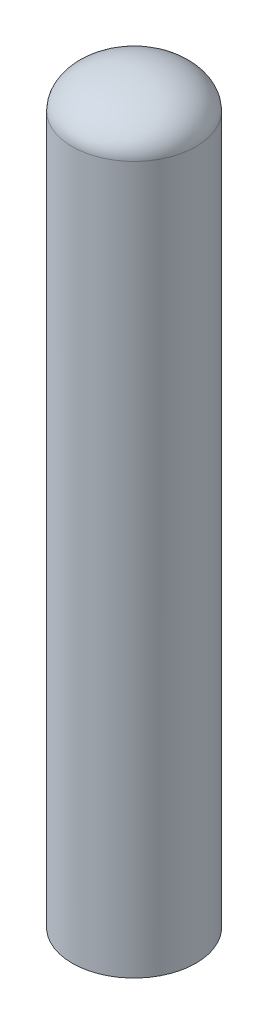
ISO-10303-21;
HEADER;
FILE_DESCRIPTION(('STEP AP214'),'2;1');
FILE_NAME('part.step','',(''),(''),'','','');
FILE_SCHEMA(('AUTOMOTIVE_DESIGN { 1 0 10303 214 1 1 1 1 }'));
ENDSEC;
DATA;
#1=APPLICATION_CONTEXT('core data for automotive mechanical design processes');
#2=APPLICATION_PROTOCOL_DEFINITION('international standard','automotive_design',2000,#1);
#3=PRODUCT_CONTEXT('',#1,'mechanical');
#4=PRODUCT('Part','Part','',(#3));
#5=PRODUCT_RELATED_PRODUCT_CATEGORY('part','',(#4));
#6=PRODUCT_DEFINITION_FORMATION('','',#4);
#7=PRODUCT_DEFINITION_CONTEXT('part definition',#1,'design');
#8=PRODUCT_DEFINITION('design','',#6,#7);
#9=PRODUCT_DEFINITION_SHAPE('','',#8);
#10=(LENGTH_UNIT() NAMED_UNIT(*) SI_UNIT(.MILLI.,.METRE.));
#11=(NAMED_UNIT(*) PLANE_ANGLE_UNIT() SI_UNIT($,.RADIAN.));
#12=(NAMED_UNIT(*) SI_UNIT($,.STERADIAN.) SOLID_ANGLE_UNIT());
#13=UNCERTAINTY_MEASURE_WITH_UNIT(LENGTH_MEASURE(1.E-05),#10,'distance_accuracy_value','');
#14=(GEOMETRIC_REPRESENTATION_CONTEXT(3) GLOBAL_UNCERTAINTY_ASSIGNED_CONTEXT((#13)) GLOBAL_UNIT_ASSIGNED_CONTEXT((#10,
#11,#12)) REPRESENTATION_CONTEXT('',''));
#15=CARTESIAN_POINT('',(0.,0.,0.));
#16=DIRECTION('',(0.,0.,1.));
#17=DIRECTION('',(1.,0.,0.));
#18=AXIS2_PLACEMENT_3D('',#15,#16,#17);
#19=CARTESIAN_POINT('',(0.,508.,0.));
#20=DIRECTION('',(0.,0.,1.));
#21=DIRECTION('',(-1.,0.,0.));
#22=AXIS2_PLACEMENT_3D('',#19,#20,#21);
#23=ELLIPSE('',#22,44.45,25.4);
#24=TRIMMED_CURVE('',#23,(PARAMETER_VALUE(1.5707963267949)),(PARAMETER_VALUE(4.71238898038469)),
.T.,.PARAMETER.);
#25=CARTESIAN_POINT('',(0.,527.05,0.));
#26=DIRECTION('',(0.,-1.,0.));
#27=AXIS1_PLACEMENT('',#25,#26);
#28=SURFACE_OF_REVOLUTION('',#24,#27);
#29=CARTESIAN_POINT('',(0.,533.4,0.));
#30=VERTEX_POINT('',#29);
#31=VERTEX_LOOP('',#30);
#32=FACE_BOUND('',#31,.T.);
#33=CARTESIAN_POINT('',(0.,508.,0.));
#34=DIRECTION('',(0.,-1.,0.));
#35=DIRECTION('',(0.,0.,-1.));
#36=AXIS2_PLACEMENT_3D('',#33,#34,#35);
#37=CIRCLE('',#36,44.45);
#38=CARTESIAN_POINT('',(0.,508.,-44.45));
#39=VERTEX_POINT('',#38);
#40=EDGE_CURVE('E11',#39,#39,#37,.T.);
#41=ORIENTED_EDGE('',*,*,#40,.F.);
#42=EDGE_LOOP('',(#41));
#43=FACE_BOUND('',#42,.T.);
#44=ADVANCED_FACE('F35',(#32,#43),#28,.F.);
#45=CARTESIAN_POINT('',(0.,0.,0.));
#46=DIRECTION('',(0.,1.,0.));
#47=DIRECTION('',(0.,0.,1.));
#48=AXIS2_PLACEMENT_3D('',#45,#46,#47);
#49=PLANE('',#48);
#50=CARTESIAN_POINT('',(0.,0.,0.));
#51=DIRECTION('',(0.,1.,0.));
#52=DIRECTION('',(0.,0.,1.));
#53=AXIS2_PLACEMENT_3D('',#50,#51,#52);
#54=CIRCLE('',#53,44.45);
#55=CARTESIAN_POINT('',(0.,0.,44.45));
#56=VERTEX_POINT('',#55);
#57=EDGE_CURVE('E44',#56,#56,#54,.T.);
#58=ORIENTED_EDGE('',*,*,#57,.F.);
#59=EDGE_LOOP('',(#58));
#60=FACE_BOUND('',#59,.T.);
#61=CARTESIAN_POINT('',(0.,0.,0.));
#62=DIRECTION('',(0.,1.,0.));
#63=DIRECTION('',(0.,0.,1.));
#64=AXIS2_PLACEMENT_3D('',#61,#62,#63);
#65=CIRCLE('',#64,38.1);
#66=CARTESIAN_POINT('',(0.,0.,38.1));
#67=VERTEX_POINT('',#66);
#68=EDGE_CURVE('E66',#67,#67,#65,.T.);
#69=ORIENTED_EDGE('',*,*,#68,.T.);
#70=EDGE_LOOP('',(#69));
#71=FACE_BOUND('',#70,.T.);
#72=ADVANCED_FACE('F52',(#60,#71),#49,.F.);
#73=CARTESIAN_POINT('',(0.,508.,0.));
#74=DIRECTION('',(0.,-1.,0.));
#75=DIRECTION('',(0.,0.,-1.));
#76=AXIS2_PLACEMENT_3D('',#73,#74,#75);
#77=CYLINDRICAL_SURFACE('',#76,44.45);
#78=ORIENTED_EDGE('',*,*,#40,.T.);
#79=EDGE_LOOP('',(#78));
#80=FACE_BOUND('',#79,.T.);
#81=ORIENTED_EDGE('',*,*,#57,.T.);
#82=EDGE_LOOP('',(#81));
#83=FACE_BOUND('',#82,.T.);
#84=ADVANCED_FACE('F55',(#80,#83),#77,.T.);
#85=CARTESIAN_POINT('',(0.,508.,0.));
#86=DIRECTION('',(0.,-1.,0.));
#87=DIRECTION('',(0.,0.,-1.));
#88=AXIS2_PLACEMENT_3D('',#85,#86,#87);
#89=CYLINDRICAL_SURFACE('',#88,38.1);
#90=CARTESIAN_POINT('',(0.,508.,0.));
#91=DIRECTION('',(0.,1.,0.));
#92=DIRECTION('',(0.,0.,1.));
#93=AXIS2_PLACEMENT_3D('',#90,#91,#92);
#94=CIRCLE('',#93,38.1);
#95=CARTESIAN_POINT('',(0.,508.,38.1));
#96=VERTEX_POINT('',#95);
#97=EDGE_CURVE('E63',#96,#96,#94,.T.);
#98=ORIENTED_EDGE('',*,*,#97,.T.);
#99=EDGE_LOOP('',(#98));
#100=FACE_BOUND('',#99,.T.);
#101=ORIENTED_EDGE('',*,*,#68,.F.);
#102=EDGE_LOOP('',(#101));
#103=FACE_BOUND('',#102,.T.);
#104=ADVANCED_FACE('F58',(#100,#103),#89,.F.);
#105=CARTESIAN_POINT('',(0.,527.05,0.));
#106=CARTESIAN_POINT('',(2.70523813783786,526.962603339208,0.));
#107=CARTESIAN_POINT('',(8.16431521955981,526.498297406408,0.));
#108=CARTESIAN_POINT('',(15.9109701093345,524.977430938329,0.));
#109=CARTESIAN_POINT('',(22.9196848690911,522.719322607588,0.));
#110=CARTESIAN_POINT('',(28.8448387943191,519.872132287875,0.));
#111=CARTESIAN_POINT('',(33.4074498239143,516.657966082797,0.));
#112=CARTESIAN_POINT('',(36.4168650380908,513.387356249061,0.));
#113=CARTESIAN_POINT('',(37.6558330728621,510.939796686019,0.));
#114=CARTESIAN_POINT('',(38.0660879005682,509.213893903106,0.));
#115=CARTESIAN_POINT('',(38.1132480810971,508.410075326666,0.));
#116=CARTESIAN_POINT('',(38.1,508.,0.));
#117=B_SPLINE_CURVE_WITH_KNOTS('',3,(#105,#106,#107,#108,#109,#110,#111,#112,#113,#114,#115,
#116),.UNSPECIFIED.,.F.,.F.,(4,1,1,1,1,1,1,1,1,4),(0.,0.196349540849362,0.392699081698724,
0.589048622548086,0.785398163397448,0.98174770424681,1.17809724509617,1.37444678594553,
1.47262155637022,1.5707963267949),.UNSPECIFIED.);
#118=CARTESIAN_POINT('',(0.,527.05,0.));
#119=DIRECTION('',(0.,-1.,0.));
#120=AXIS1_PLACEMENT('',#118,#119);
#121=SURFACE_OF_REVOLUTION('',#117,#120);
#122=ORIENTED_EDGE('',*,*,#97,.F.);
#123=EDGE_LOOP('',(#122));
#124=FACE_BOUND('',#123,.T.);
#125=CARTESIAN_POINT('',(0.,527.05,0.));
#126=VERTEX_POINT('',#125);
#127=VERTEX_LOOP('',#126);
#128=FACE_BOUND('',#127,.T.);
#129=ADVANCED_FACE('F37',(#124,#128),#121,.F.);
#130=CLOSED_SHELL('',(#44,#72,#84,#104,#129));
#131=MANIFOLD_SOLID_BREP('B2',#130);
#132=ADVANCED_BREP_SHAPE_REPRESENTATION('',(#18,#131),#14);
#133=SHAPE_DEFINITION_REPRESENTATION(#9,#132);
ENDSEC;
END-ISO-10303-21;
